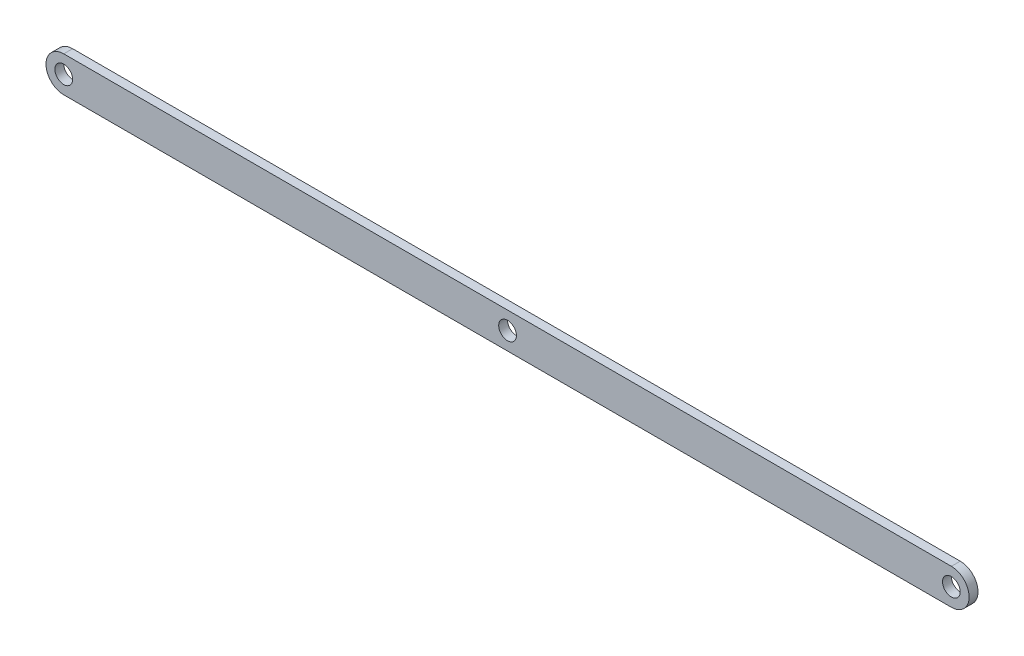
ISO-10303-21;
HEADER;
FILE_DESCRIPTION(('STEP AP214'),'2;1');
FILE_NAME('part.step','',(''),(''),'','','');
FILE_SCHEMA(('AUTOMOTIVE_DESIGN { 1 0 10303 214 1 1 1 1 }'));
ENDSEC;
DATA;
#1=APPLICATION_CONTEXT('core data for automotive mechanical design processes');
#2=APPLICATION_PROTOCOL_DEFINITION('international standard','automotive_design',2000,#1);
#3=PRODUCT_CONTEXT('',#1,'mechanical');
#4=PRODUCT('Part','Part','',(#3));
#5=PRODUCT_RELATED_PRODUCT_CATEGORY('part','',(#4));
#6=PRODUCT_DEFINITION_FORMATION('','',#4);
#7=PRODUCT_DEFINITION_CONTEXT('part definition',#1,'design');
#8=PRODUCT_DEFINITION('design','',#6,#7);
#9=PRODUCT_DEFINITION_SHAPE('','',#8);
#10=(LENGTH_UNIT() NAMED_UNIT(*) SI_UNIT(.MILLI.,.METRE.));
#11=(NAMED_UNIT(*) PLANE_ANGLE_UNIT() SI_UNIT($,.RADIAN.));
#12=(NAMED_UNIT(*) SI_UNIT($,.STERADIAN.) SOLID_ANGLE_UNIT());
#13=UNCERTAINTY_MEASURE_WITH_UNIT(LENGTH_MEASURE(1.E-05),#10,'distance_accuracy_value','');
#14=(GEOMETRIC_REPRESENTATION_CONTEXT(3) GLOBAL_UNCERTAINTY_ASSIGNED_CONTEXT((#13)) GLOBAL_UNIT_ASSIGNED_CONTEXT((#10,
#11,#12)) REPRESENTATION_CONTEXT('',''));
#15=CARTESIAN_POINT('',(0.,0.,0.));
#16=DIRECTION('',(0.,0.,1.));
#17=DIRECTION('',(1.,0.,0.));
#18=AXIS2_PLACEMENT_3D('',#15,#16,#17);
#19=CARTESIAN_POINT('',(-250.,0.,5.));
#20=DIRECTION('',(0.,0.,1.));
#21=DIRECTION('',(1.,0.,0.));
#22=AXIS2_PLACEMENT_3D('',#19,#20,#21);
#23=PLANE('',#22);
#24=CARTESIAN_POINT('',(0.,0.,5.));
#25=DIRECTION('',(0.,0.,1.));
#26=DIRECTION('',(1.,0.,0.));
#27=AXIS2_PLACEMENT_3D('',#24,#25,#26);
#28=CIRCLE('',#27,4.99999999999999);
#29=CARTESIAN_POINT('',(4.99999999999999,0.,5.));
#30=VERTEX_POINT('',#29);
#31=EDGE_CURVE('E119',#30,#30,#28,.T.);
#32=ORIENTED_EDGE('',*,*,#31,.F.);
#33=EDGE_LOOP('',(#32));
#34=FACE_BOUND('',#33,.T.);
#35=CARTESIAN_POINT('',(-250.,0.,5.));
#36=DIRECTION('',(0.,0.,1.));
#37=DIRECTION('',(1.,0.,0.));
#38=AXIS2_PLACEMENT_3D('',#35,#36,#37);
#39=CIRCLE('',#38,10.);
#40=CARTESIAN_POINT('',(-250.,9.99999999999997,5.));
#41=VERTEX_POINT('',#40);
#42=CARTESIAN_POINT('',(-250.,-10.,5.));
#43=VERTEX_POINT('',#42);
#44=EDGE_CURVE('E89',#41,#43,#39,.T.);
#45=ORIENTED_EDGE('',*,*,#44,.T.);
#46=DIRECTION('',(1.,0.,0.));
#47=VECTOR('',#46,1.);
#48=CARTESIAN_POINT('',(-250.,-10.,5.));
#49=LINE('',#48,#47);
#50=CARTESIAN_POINT('',(250.,-10.,5.));
#51=VERTEX_POINT('',#50);
#52=EDGE_CURVE('E84',#43,#51,#49,.T.);
#53=ORIENTED_EDGE('',*,*,#52,.T.);
#54=CARTESIAN_POINT('',(250.,0.,5.));
#55=DIRECTION('',(0.,0.,1.));
#56=DIRECTION('',(1.,0.,0.));
#57=AXIS2_PLACEMENT_3D('',#54,#55,#56);
#58=CIRCLE('',#57,10.);
#59=CARTESIAN_POINT('',(250.,10.0000000000001,5.));
#60=VERTEX_POINT('',#59);
#61=EDGE_CURVE('E87',#51,#60,#58,.T.);
#62=ORIENTED_EDGE('',*,*,#61,.T.);
#63=DIRECTION('',(-1.,0.,0.));
#64=VECTOR('',#63,1.);
#65=CARTESIAN_POINT('',(-250.,9.99999999999997,5.));
#66=LINE('',#65,#64);
#67=EDGE_CURVE('E54',#60,#41,#66,.T.);
#68=ORIENTED_EDGE('',*,*,#67,.T.);
#69=EDGE_LOOP('',(#45,#53,#62,#68));
#70=FACE_BOUND('',#69,.T.);
#71=CARTESIAN_POINT('',(-250.,0.,5.));
#72=DIRECTION('',(0.,0.,1.));
#73=DIRECTION('',(1.,0.,0.));
#74=AXIS2_PLACEMENT_3D('',#71,#72,#73);
#75=CIRCLE('',#74,4.99999999999999);
#76=CARTESIAN_POINT('',(-245.,0.,5.));
#77=VERTEX_POINT('',#76);
#78=EDGE_CURVE('E104',#77,#77,#75,.T.);
#79=ORIENTED_EDGE('',*,*,#78,.F.);
#80=EDGE_LOOP('',(#79));
#81=FACE_BOUND('',#80,.T.);
#82=CARTESIAN_POINT('',(250.,0.,5.));
#83=DIRECTION('',(0.,0.,1.));
#84=DIRECTION('',(1.,0.,0.));
#85=AXIS2_PLACEMENT_3D('',#82,#83,#84);
#86=CIRCLE('',#85,4.99999999999999);
#87=CARTESIAN_POINT('',(255.,0.,5.));
#88=VERTEX_POINT('',#87);
#89=EDGE_CURVE('E125',#88,#88,#86,.T.);
#90=ORIENTED_EDGE('',*,*,#89,.F.);
#91=EDGE_LOOP('',(#90));
#92=FACE_BOUND('',#91,.T.);
#93=ADVANCED_FACE('F37',(#34,#70,#81,#92),#23,.T.);
#94=CARTESIAN_POINT('',(-250.,0.,0.));
#95=DIRECTION('',(0.,0.,1.));
#96=DIRECTION('',(1.,0.,0.));
#97=AXIS2_PLACEMENT_3D('',#94,#95,#96);
#98=PLANE('',#97);
#99=CARTESIAN_POINT('',(-250.,0.,0.));
#100=DIRECTION('',(0.,0.,1.));
#101=DIRECTION('',(1.,0.,0.));
#102=AXIS2_PLACEMENT_3D('',#99,#100,#101);
#103=CIRCLE('',#102,10.);
#104=CARTESIAN_POINT('',(-250.,9.99999999999997,0.));
#105=VERTEX_POINT('',#104);
#106=CARTESIAN_POINT('',(-250.,-10.,0.));
#107=VERTEX_POINT('',#106);
#108=EDGE_CURVE('E101',#105,#107,#103,.T.);
#109=ORIENTED_EDGE('',*,*,#108,.F.);
#110=DIRECTION('',(-1.,0.,0.));
#111=VECTOR('',#110,1.);
#112=CARTESIAN_POINT('',(-250.,9.99999999999997,0.));
#113=LINE('',#112,#111);
#114=CARTESIAN_POINT('',(250.,10.0000000000001,0.));
#115=VERTEX_POINT('',#114);
#116=EDGE_CURVE('E77',#115,#105,#113,.T.);
#117=ORIENTED_EDGE('',*,*,#116,.F.);
#118=CARTESIAN_POINT('',(250.,0.,0.));
#119=DIRECTION('',(0.,0.,1.));
#120=DIRECTION('',(1.,0.,0.));
#121=AXIS2_PLACEMENT_3D('',#118,#119,#120);
#122=CIRCLE('',#121,10.);
#123=CARTESIAN_POINT('',(250.,-10.,0.));
#124=VERTEX_POINT('',#123);
#125=EDGE_CURVE('E71',#124,#115,#122,.T.);
#126=ORIENTED_EDGE('',*,*,#125,.F.);
#127=DIRECTION('',(1.,0.,0.));
#128=VECTOR('',#127,1.);
#129=CARTESIAN_POINT('',(-250.,-10.,0.));
#130=LINE('',#129,#128);
#131=EDGE_CURVE('E93',#107,#124,#130,.T.);
#132=ORIENTED_EDGE('',*,*,#131,.F.);
#133=EDGE_LOOP('',(#109,#117,#126,#132));
#134=FACE_BOUND('',#133,.T.);
#135=CARTESIAN_POINT('',(-250.,0.,0.));
#136=DIRECTION('',(0.,0.,1.));
#137=DIRECTION('',(1.,0.,0.));
#138=AXIS2_PLACEMENT_3D('',#135,#136,#137);
#139=CIRCLE('',#138,4.99999999999999);
#140=CARTESIAN_POINT('',(-245.,0.,0.));
#141=VERTEX_POINT('',#140);
#142=EDGE_CURVE('E116',#141,#141,#139,.T.);
#143=ORIENTED_EDGE('',*,*,#142,.T.);
#144=EDGE_LOOP('',(#143));
#145=FACE_BOUND('',#144,.T.);
#146=CARTESIAN_POINT('',(0.,0.,0.));
#147=DIRECTION('',(0.,0.,1.));
#148=DIRECTION('',(1.,0.,0.));
#149=AXIS2_PLACEMENT_3D('',#146,#147,#148);
#150=CIRCLE('',#149,4.99999999999999);
#151=CARTESIAN_POINT('',(4.99999999999999,0.,0.));
#152=VERTEX_POINT('',#151);
#153=EDGE_CURVE('E122',#152,#152,#150,.T.);
#154=ORIENTED_EDGE('',*,*,#153,.T.);
#155=EDGE_LOOP('',(#154));
#156=FACE_BOUND('',#155,.T.);
#157=CARTESIAN_POINT('',(250.,0.,0.));
#158=DIRECTION('',(0.,0.,1.));
#159=DIRECTION('',(1.,0.,0.));
#160=AXIS2_PLACEMENT_3D('',#157,#158,#159);
#161=CIRCLE('',#160,4.99999999999999);
#162=CARTESIAN_POINT('',(255.,0.,0.));
#163=VERTEX_POINT('',#162);
#164=EDGE_CURVE('E128',#163,#163,#161,.T.);
#165=ORIENTED_EDGE('',*,*,#164,.T.);
#166=EDGE_LOOP('',(#165));
#167=FACE_BOUND('',#166,.T.);
#168=ADVANCED_FACE('F112',(#134,#145,#156,#167),#98,.F.);
#169=CARTESIAN_POINT('',(-250.,0.,5.));
#170=DIRECTION('',(0.,0.,-1.));
#171=DIRECTION('',(-1.,0.,0.));
#172=AXIS2_PLACEMENT_3D('',#169,#170,#171);
#173=CYLINDRICAL_SURFACE('',#172,10.);
#174=ORIENTED_EDGE('',*,*,#108,.T.);
#175=DIRECTION('',(0.,0.,-1.));
#176=VECTOR('',#175,1.);
#177=CARTESIAN_POINT('',(-250.,-10.,5.));
#178=LINE('',#177,#176);
#179=EDGE_CURVE('E11',#43,#107,#178,.T.);
#180=ORIENTED_EDGE('',*,*,#179,.F.);
#181=ORIENTED_EDGE('',*,*,#44,.F.);
#182=DIRECTION('',(0.,0.,-1.));
#183=VECTOR('',#182,1.);
#184=CARTESIAN_POINT('',(-250.,9.99999999999997,5.));
#185=LINE('',#184,#183);
#186=EDGE_CURVE('E97',#41,#105,#185,.T.);
#187=ORIENTED_EDGE('',*,*,#186,.T.);
#188=EDGE_LOOP('',(#174,#180,#181,#187));
#189=FACE_BOUND('',#188,.T.);
#190=ADVANCED_FACE('F39',(#189),#173,.T.);
#191=CARTESIAN_POINT('',(-250.,-10.,5.));
#192=DIRECTION('',(0.,1.,0.));
#193=DIRECTION('',(0.,0.,1.));
#194=AXIS2_PLACEMENT_3D('',#191,#192,#193);
#195=PLANE('',#194);
#196=ORIENTED_EDGE('',*,*,#131,.T.);
#197=DIRECTION('',(0.,0.,-1.));
#198=VECTOR('',#197,1.);
#199=CARTESIAN_POINT('',(250.,-10.,5.));
#200=LINE('',#199,#198);
#201=EDGE_CURVE('E46',#51,#124,#200,.T.);
#202=ORIENTED_EDGE('',*,*,#201,.F.);
#203=ORIENTED_EDGE('',*,*,#52,.F.);
#204=ORIENTED_EDGE('',*,*,#179,.T.);
#205=EDGE_LOOP('',(#196,#202,#203,#204));
#206=FACE_BOUND('',#205,.T.);
#207=ADVANCED_FACE('F92',(#206),#195,.F.);
#208=CARTESIAN_POINT('',(250.,0.,5.));
#209=DIRECTION('',(0.,0.,-1.));
#210=DIRECTION('',(-1.,0.,0.));
#211=AXIS2_PLACEMENT_3D('',#208,#209,#210);
#212=CYLINDRICAL_SURFACE('',#211,10.);
#213=ORIENTED_EDGE('',*,*,#125,.T.);
#214=DIRECTION('',(0.,0.,-1.));
#215=VECTOR('',#214,1.);
#216=CARTESIAN_POINT('',(250.,10.0000000000001,5.));
#217=LINE('',#216,#215);
#218=EDGE_CURVE('E94',#60,#115,#217,.T.);
#219=ORIENTED_EDGE('',*,*,#218,.F.);
#220=ORIENTED_EDGE('',*,*,#61,.F.);
#221=ORIENTED_EDGE('',*,*,#201,.T.);
#222=EDGE_LOOP('',(#213,#219,#220,#221));
#223=FACE_BOUND('',#222,.T.);
#224=ADVANCED_FACE('F95',(#223),#212,.T.);
#225=CARTESIAN_POINT('',(-250.,9.99999999999997,5.));
#226=DIRECTION('',(0.,-1.,0.));
#227=DIRECTION('',(1.,0.,0.));
#228=AXIS2_PLACEMENT_3D('',#225,#226,#227);
#229=PLANE('',#228);
#230=ORIENTED_EDGE('',*,*,#116,.T.);
#231=ORIENTED_EDGE('',*,*,#186,.F.);
#232=ORIENTED_EDGE('',*,*,#67,.F.);
#233=ORIENTED_EDGE('',*,*,#218,.T.);
#234=EDGE_LOOP('',(#230,#231,#232,#233));
#235=FACE_BOUND('',#234,.T.);
#236=ADVANCED_FACE('F109',(#235),#229,.F.);
#237=CARTESIAN_POINT('',(-250.,0.,5.));
#238=DIRECTION('',(0.,0.,-1.));
#239=DIRECTION('',(-1.,0.,0.));
#240=AXIS2_PLACEMENT_3D('',#237,#238,#239);
#241=CYLINDRICAL_SURFACE('',#240,4.99999999999999);
#242=ORIENTED_EDGE('',*,*,#78,.T.);
#243=EDGE_LOOP('',(#242));
#244=FACE_BOUND('',#243,.T.);
#245=ORIENTED_EDGE('',*,*,#142,.F.);
#246=EDGE_LOOP('',(#245));
#247=FACE_BOUND('',#246,.T.);
#248=ADVANCED_FACE('F146',(#244,#247),#241,.F.);
#249=CARTESIAN_POINT('',(0.,0.,5.));
#250=DIRECTION('',(0.,0.,-1.));
#251=DIRECTION('',(-1.,0.,0.));
#252=AXIS2_PLACEMENT_3D('',#249,#250,#251);
#253=CYLINDRICAL_SURFACE('',#252,4.99999999999999);
#254=ORIENTED_EDGE('',*,*,#31,.T.);
#255=EDGE_LOOP('',(#254));
#256=FACE_BOUND('',#255,.T.);
#257=ORIENTED_EDGE('',*,*,#153,.F.);
#258=EDGE_LOOP('',(#257));
#259=FACE_BOUND('',#258,.T.);
#260=ADVANCED_FACE('F192',(#256,#259),#253,.F.);
#261=CARTESIAN_POINT('',(250.,0.,5.));
#262=DIRECTION('',(0.,0.,-1.));
#263=DIRECTION('',(-1.,0.,0.));
#264=AXIS2_PLACEMENT_3D('',#261,#262,#263);
#265=CYLINDRICAL_SURFACE('',#264,4.99999999999999);
#266=ORIENTED_EDGE('',*,*,#89,.T.);
#267=EDGE_LOOP('',(#266));
#268=FACE_BOUND('',#267,.T.);
#269=ORIENTED_EDGE('',*,*,#164,.F.);
#270=EDGE_LOOP('',(#269));
#271=FACE_BOUND('',#270,.T.);
#272=ADVANCED_FACE('F134',(#268,#271),#265,.F.);
#273=CLOSED_SHELL('',(#93,#168,#190,#207,#224,#236,#248,#260,#272));
#274=MANIFOLD_SOLID_BREP('B2',#273);
#275=ADVANCED_BREP_SHAPE_REPRESENTATION('',(#18,#274),#14);
#276=SHAPE_DEFINITION_REPRESENTATION(#9,#275);
ENDSEC;
END-ISO-10303-21;
